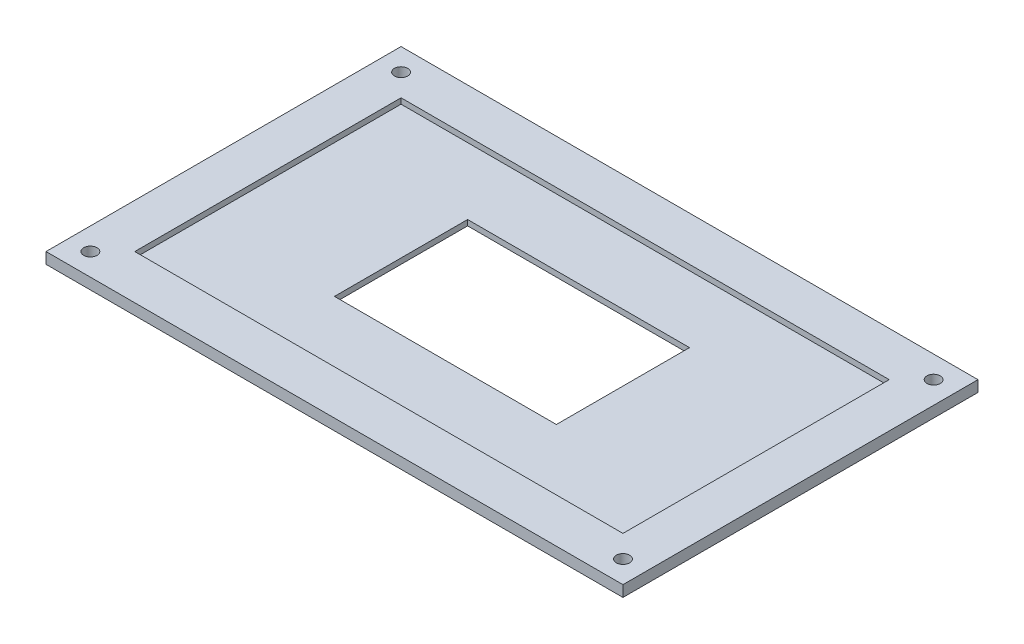
ISO-10303-21;
HEADER;
FILE_DESCRIPTION(('STEP AP214'),'2;1');
FILE_NAME('part.step','',(''),(''),'','','');
FILE_SCHEMA(('AUTOMOTIVE_DESIGN { 1 0 10303 214 1 1 1 1 }'));
ENDSEC;
DATA;
#1=APPLICATION_CONTEXT('core data for automotive mechanical design processes');
#2=APPLICATION_PROTOCOL_DEFINITION('international standard','automotive_design',2000,#1);
#3=PRODUCT_CONTEXT('',#1,'mechanical');
#4=PRODUCT('Part','Part','',(#3));
#5=PRODUCT_RELATED_PRODUCT_CATEGORY('part','',(#4));
#6=PRODUCT_DEFINITION_FORMATION('','',#4);
#7=PRODUCT_DEFINITION_CONTEXT('part definition',#1,'design');
#8=PRODUCT_DEFINITION('design','',#6,#7);
#9=PRODUCT_DEFINITION_SHAPE('','',#8);
#10=(LENGTH_UNIT() NAMED_UNIT(*) SI_UNIT(.MILLI.,.METRE.));
#11=(NAMED_UNIT(*) PLANE_ANGLE_UNIT() SI_UNIT($,.RADIAN.));
#12=(NAMED_UNIT(*) SI_UNIT($,.STERADIAN.) SOLID_ANGLE_UNIT());
#13=UNCERTAINTY_MEASURE_WITH_UNIT(LENGTH_MEASURE(1.E-05),#10,'distance_accuracy_value','');
#14=(GEOMETRIC_REPRESENTATION_CONTEXT(3) GLOBAL_UNCERTAINTY_ASSIGNED_CONTEXT((#13)) GLOBAL_UNIT_ASSIGNED_CONTEXT((#10,
#11,#12)) REPRESENTATION_CONTEXT('',''));
#15=CARTESIAN_POINT('',(0.,0.,0.));
#16=DIRECTION('',(0.,0.,1.));
#17=DIRECTION('',(1.,0.,0.));
#18=AXIS2_PLACEMENT_3D('',#15,#16,#17);
#19=CARTESIAN_POINT('',(0.,2.5,0.));
#20=DIRECTION('',(1.,0.,0.));
#21=DIRECTION('',(0.,0.,-1.));
#22=AXIS2_PLACEMENT_3D('',#19,#20,#21);
#23=PLANE('',#22);
#24=DIRECTION('',(0.,0.,1.));
#25=VECTOR('',#24,1.);
#26=CARTESIAN_POINT('',(0.,0.,0.));
#27=LINE('',#26,#25);
#28=CARTESIAN_POINT('',(0.,0.,-80.));
#29=VERTEX_POINT('',#28);
#30=CARTESIAN_POINT('',(0.,0.,0.));
#31=VERTEX_POINT('',#30);
#32=EDGE_CURVE('E278',#29,#31,#27,.T.);
#33=ORIENTED_EDGE('',*,*,#32,.T.);
#34=DIRECTION('',(0.,-1.,0.));
#35=VECTOR('',#34,1.);
#36=CARTESIAN_POINT('',(0.,2.5,0.));
#37=LINE('',#36,#35);
#38=CARTESIAN_POINT('',(0.,2.5,0.));
#39=VERTEX_POINT('',#38);
#40=EDGE_CURVE('E11',#39,#31,#37,.T.);
#41=ORIENTED_EDGE('',*,*,#40,.F.);
#42=DIRECTION('',(0.,0.,1.));
#43=VECTOR('',#42,1.);
#44=CARTESIAN_POINT('',(0.,2.5,0.));
#45=LINE('',#44,#43);
#46=CARTESIAN_POINT('',(0.,2.5,-80.));
#47=VERTEX_POINT('',#46);
#48=EDGE_CURVE('E288',#47,#39,#45,.T.);
#49=ORIENTED_EDGE('',*,*,#48,.F.);
#50=DIRECTION('',(0.,-1.,0.));
#51=VECTOR('',#50,1.);
#52=CARTESIAN_POINT('',(0.,2.5,-80.));
#53=LINE('',#52,#51);
#54=EDGE_CURVE('E302',#47,#29,#53,.T.);
#55=ORIENTED_EDGE('',*,*,#54,.T.);
#56=EDGE_LOOP('',(#33,#41,#49,#55));
#57=FACE_BOUND('',#56,.T.);
#58=ADVANCED_FACE('F49',(#57),#23,.F.);
#59=CARTESIAN_POINT('',(0.,2.5,0.));
#60=DIRECTION('',(0.,0.,-1.));
#61=DIRECTION('',(-1.,0.,0.));
#62=AXIS2_PLACEMENT_3D('',#59,#60,#61);
#63=PLANE('',#62);
#64=DIRECTION('',(1.,0.,0.));
#65=VECTOR('',#64,1.);
#66=CARTESIAN_POINT('',(0.,0.,0.));
#67=LINE('',#66,#65);
#68=CARTESIAN_POINT('',(130.,0.,0.));
#69=VERTEX_POINT('',#68);
#70=EDGE_CURVE('E306',#31,#69,#67,.T.);
#71=ORIENTED_EDGE('',*,*,#70,.T.);
#72=DIRECTION('',(0.,-1.,0.));
#73=VECTOR('',#72,1.);
#74=CARTESIAN_POINT('',(130.,2.5,0.));
#75=LINE('',#74,#73);
#76=CARTESIAN_POINT('',(130.,2.5,0.));
#77=VERTEX_POINT('',#76);
#78=EDGE_CURVE('E57',#77,#69,#75,.T.);
#79=ORIENTED_EDGE('',*,*,#78,.F.);
#80=DIRECTION('',(1.,0.,0.));
#81=VECTOR('',#80,1.);
#82=CARTESIAN_POINT('',(0.,2.5,0.));
#83=LINE('',#82,#81);
#84=EDGE_CURVE('E292',#39,#77,#83,.T.);
#85=ORIENTED_EDGE('',*,*,#84,.F.);
#86=ORIENTED_EDGE('',*,*,#40,.T.);
#87=EDGE_LOOP('',(#71,#79,#85,#86));
#88=FACE_BOUND('',#87,.T.);
#89=ADVANCED_FACE('F341',(#88),#63,.F.);
#90=CARTESIAN_POINT('',(130.,2.5,0.));
#91=DIRECTION('',(-1.,0.,0.));
#92=DIRECTION('',(0.,0.,1.));
#93=AXIS2_PLACEMENT_3D('',#90,#91,#92);
#94=PLANE('',#93);
#95=DIRECTION('',(0.,0.,-1.));
#96=VECTOR('',#95,1.);
#97=CARTESIAN_POINT('',(130.,0.,0.));
#98=LINE('',#97,#96);
#99=CARTESIAN_POINT('',(130.,0.,-80.));
#100=VERTEX_POINT('',#99);
#101=EDGE_CURVE('E309',#69,#100,#98,.T.);
#102=ORIENTED_EDGE('',*,*,#101,.T.);
#103=DIRECTION('',(0.,-1.,0.));
#104=VECTOR('',#103,1.);
#105=CARTESIAN_POINT('',(130.,2.5,-80.));
#106=LINE('',#105,#104);
#107=CARTESIAN_POINT('',(130.,2.5,-80.));
#108=VERTEX_POINT('',#107);
#109=EDGE_CURVE('E317',#108,#100,#106,.T.);
#110=ORIENTED_EDGE('',*,*,#109,.F.);
#111=DIRECTION('',(0.,0.,-1.));
#112=VECTOR('',#111,1.);
#113=CARTESIAN_POINT('',(130.,2.5,0.));
#114=LINE('',#113,#112);
#115=EDGE_CURVE('E296',#77,#108,#114,.T.);
#116=ORIENTED_EDGE('',*,*,#115,.F.);
#117=ORIENTED_EDGE('',*,*,#78,.T.);
#118=EDGE_LOOP('',(#102,#110,#116,#117));
#119=FACE_BOUND('',#118,.T.);
#120=ADVANCED_FACE('F326',(#119),#94,.F.);
#121=CARTESIAN_POINT('',(0.,2.5,-80.));
#122=DIRECTION('',(0.,0.,1.));
#123=DIRECTION('',(1.,0.,0.));
#124=AXIS2_PLACEMENT_3D('',#121,#122,#123);
#125=PLANE('',#124);
#126=DIRECTION('',(-1.,0.,0.));
#127=VECTOR('',#126,1.);
#128=CARTESIAN_POINT('',(0.,0.,-80.));
#129=LINE('',#128,#127);
#130=EDGE_CURVE('E293',#100,#29,#129,.T.);
#131=ORIENTED_EDGE('',*,*,#130,.T.);
#132=ORIENTED_EDGE('',*,*,#54,.F.);
#133=DIRECTION('',(-1.,0.,0.));
#134=VECTOR('',#133,1.);
#135=CARTESIAN_POINT('',(0.,2.5,-80.));
#136=LINE('',#135,#134);
#137=EDGE_CURVE('E299',#108,#47,#136,.T.);
#138=ORIENTED_EDGE('',*,*,#137,.F.);
#139=ORIENTED_EDGE('',*,*,#109,.T.);
#140=EDGE_LOOP('',(#131,#132,#138,#139));
#141=FACE_BOUND('',#140,.T.);
#142=ADVANCED_FACE('F334',(#141),#125,.F.);
#143=CARTESIAN_POINT('',(0.,2.5,0.));
#144=DIRECTION('',(0.,-1.,0.));
#145=DIRECTION('',(0.,0.,-1.));
#146=AXIS2_PLACEMENT_3D('',#143,#144,#145);
#147=PLANE('',#146);
#148=CARTESIAN_POINT('',(4.99999999999995,2.5,-5.));
#149=DIRECTION('',(0.,1.,0.));
#150=DIRECTION('',(0.,0.,1.));
#151=AXIS2_PLACEMENT_3D('',#148,#149,#150);
#152=CIRCLE('',#151,1.5);
#153=CARTESIAN_POINT('',(4.99999999999995,2.5,-3.5));
#154=VERTEX_POINT('',#153);
#155=EDGE_CURVE('E229',#154,#154,#152,.T.);
#156=ORIENTED_EDGE('',*,*,#155,.F.);
#157=EDGE_LOOP('',(#156));
#158=FACE_BOUND('',#157,.T.);
#159=CARTESIAN_POINT('',(125.,2.5,-5.));
#160=DIRECTION('',(0.,1.,0.));
#161=DIRECTION('',(0.,0.,1.));
#162=AXIS2_PLACEMENT_3D('',#159,#160,#161);
#163=CIRCLE('',#162,1.5);
#164=CARTESIAN_POINT('',(125.,2.5,-3.5));
#165=VERTEX_POINT('',#164);
#166=EDGE_CURVE('E221',#165,#165,#163,.T.);
#167=ORIENTED_EDGE('',*,*,#166,.F.);
#168=EDGE_LOOP('',(#167));
#169=FACE_BOUND('',#168,.T.);
#170=CARTESIAN_POINT('',(125.,2.5,-75.));
#171=DIRECTION('',(0.,1.,0.));
#172=DIRECTION('',(0.,0.,1.));
#173=AXIS2_PLACEMENT_3D('',#170,#171,#172);
#174=CIRCLE('',#173,1.5);
#175=CARTESIAN_POINT('',(125.,2.5,-73.5));
#176=VERTEX_POINT('',#175);
#177=EDGE_CURVE('E212',#176,#176,#174,.T.);
#178=ORIENTED_EDGE('',*,*,#177,.F.);
#179=EDGE_LOOP('',(#178));
#180=FACE_BOUND('',#179,.T.);
#181=CARTESIAN_POINT('',(4.99999999999994,2.5,-75.));
#182=DIRECTION('',(0.,1.,0.));
#183=DIRECTION('',(0.,0.,1.));
#184=AXIS2_PLACEMENT_3D('',#181,#182,#183);
#185=CIRCLE('',#184,1.5);
#186=CARTESIAN_POINT('',(4.99999999999994,2.5,-73.5));
#187=VERTEX_POINT('',#186);
#188=EDGE_CURVE('E216',#187,#187,#185,.T.);
#189=ORIENTED_EDGE('',*,*,#188,.F.);
#190=EDGE_LOOP('',(#189));
#191=FACE_BOUND('',#190,.T.);
#192=DIRECTION('',(1.,0.,0.));
#193=VECTOR('',#192,1.);
#194=CARTESIAN_POINT('',(9.99999999999995,2.5,-10.));
#195=LINE('',#194,#193);
#196=CARTESIAN_POINT('',(9.99999999999995,2.5,-10.));
#197=VERTEX_POINT('',#196);
#198=CARTESIAN_POINT('',(120.,2.5,-10.));
#199=VERTEX_POINT('',#198);
#200=EDGE_CURVE('E264',#197,#199,#195,.T.);
#201=ORIENTED_EDGE('',*,*,#200,.F.);
#202=DIRECTION('',(0.,0.,1.));
#203=VECTOR('',#202,1.);
#204=CARTESIAN_POINT('',(9.99999999999994,2.5,-70.));
#205=LINE('',#204,#203);
#206=CARTESIAN_POINT('',(9.99999999999994,2.5,-70.));
#207=VERTEX_POINT('',#206);
#208=EDGE_CURVE('E240',#207,#197,#205,.T.);
#209=ORIENTED_EDGE('',*,*,#208,.F.);
#210=DIRECTION('',(-1.,0.,0.));
#211=VECTOR('',#210,1.);
#212=CARTESIAN_POINT('',(9.99999999999994,2.5,-70.));
#213=LINE('',#212,#211);
#214=CARTESIAN_POINT('',(120.,2.5,-70.));
#215=VERTEX_POINT('',#214);
#216=EDGE_CURVE('E249',#215,#207,#213,.T.);
#217=ORIENTED_EDGE('',*,*,#216,.F.);
#218=DIRECTION('',(0.,0.,-1.));
#219=VECTOR('',#218,1.);
#220=CARTESIAN_POINT('',(120.,2.5,-70.));
#221=LINE('',#220,#219);
#222=EDGE_CURVE('E268',#199,#215,#221,.T.);
#223=ORIENTED_EDGE('',*,*,#222,.F.);
#224=EDGE_LOOP('',(#201,#209,#217,#223));
#225=FACE_BOUND('',#224,.T.);
#226=ORIENTED_EDGE('',*,*,#48,.T.);
#227=ORIENTED_EDGE('',*,*,#84,.T.);
#228=ORIENTED_EDGE('',*,*,#115,.T.);
#229=ORIENTED_EDGE('',*,*,#137,.T.);
#230=EDGE_LOOP('',(#226,#227,#228,#229));
#231=FACE_BOUND('',#230,.T.);
#232=ADVANCED_FACE('F340',(#158,#169,#180,#191,#225,#231),#147,.F.);
#233=CARTESIAN_POINT('',(0.,0.,0.));
#234=DIRECTION('',(0.,-1.,0.));
#235=DIRECTION('',(0.,0.,-1.));
#236=AXIS2_PLACEMENT_3D('',#233,#234,#235);
#237=PLANE('',#236);
#238=DIRECTION('',(0.,0.,1.));
#239=VECTOR('',#238,1.);
#240=CARTESIAN_POINT('',(39.9999999999999,0.,-55.));
#241=LINE('',#240,#239);
#242=CARTESIAN_POINT('',(39.9999999999999,0.,-55.));
#243=VERTEX_POINT('',#242);
#244=CARTESIAN_POINT('',(40.,0.,-25.));
#245=VERTEX_POINT('',#244);
#246=EDGE_CURVE('E165',#243,#245,#241,.T.);
#247=ORIENTED_EDGE('',*,*,#246,.T.);
#248=DIRECTION('',(1.,0.,0.));
#249=VECTOR('',#248,1.);
#250=CARTESIAN_POINT('',(40.,0.,-25.));
#251=LINE('',#250,#249);
#252=CARTESIAN_POINT('',(89.9999999999999,0.,-25.));
#253=VERTEX_POINT('',#252);
#254=EDGE_CURVE('E177',#245,#253,#251,.T.);
#255=ORIENTED_EDGE('',*,*,#254,.T.);
#256=DIRECTION('',(0.,0.,-1.));
#257=VECTOR('',#256,1.);
#258=CARTESIAN_POINT('',(89.9999999999999,0.,-55.));
#259=LINE('',#258,#257);
#260=CARTESIAN_POINT('',(89.9999999999999,0.,-55.));
#261=VERTEX_POINT('',#260);
#262=EDGE_CURVE('E74',#253,#261,#259,.T.);
#263=ORIENTED_EDGE('',*,*,#262,.T.);
#264=DIRECTION('',(-1.,0.,0.));
#265=VECTOR('',#264,1.);
#266=CARTESIAN_POINT('',(39.9999999999999,0.,-55.));
#267=LINE('',#266,#265);
#268=EDGE_CURVE('E174',#261,#243,#267,.T.);
#269=ORIENTED_EDGE('',*,*,#268,.T.);
#270=EDGE_LOOP('',(#247,#255,#263,#269));
#271=FACE_BOUND('',#270,.T.);
#272=CARTESIAN_POINT('',(4.99999999999995,0.,-5.));
#273=DIRECTION('',(0.,1.,0.));
#274=DIRECTION('',(0.,0.,1.));
#275=AXIS2_PLACEMENT_3D('',#272,#273,#274);
#276=CIRCLE('',#275,1.5);
#277=CARTESIAN_POINT('',(4.99999999999995,0.,-3.5));
#278=VERTEX_POINT('',#277);
#279=EDGE_CURVE('E206',#278,#278,#276,.T.);
#280=ORIENTED_EDGE('',*,*,#279,.T.);
#281=EDGE_LOOP('',(#280));
#282=FACE_BOUND('',#281,.T.);
#283=CARTESIAN_POINT('',(125.,0.,-5.));
#284=DIRECTION('',(0.,1.,0.));
#285=DIRECTION('',(0.,0.,1.));
#286=AXIS2_PLACEMENT_3D('',#283,#284,#285);
#287=CIRCLE('',#286,1.5);
#288=CARTESIAN_POINT('',(125.,0.,-3.5));
#289=VERTEX_POINT('',#288);
#290=EDGE_CURVE('E225',#289,#289,#287,.T.);
#291=ORIENTED_EDGE('',*,*,#290,.T.);
#292=EDGE_LOOP('',(#291));
#293=FACE_BOUND('',#292,.T.);
#294=CARTESIAN_POINT('',(125.,0.,-75.));
#295=DIRECTION('',(0.,1.,0.));
#296=DIRECTION('',(0.,0.,1.));
#297=AXIS2_PLACEMENT_3D('',#294,#295,#296);
#298=CIRCLE('',#297,1.5);
#299=CARTESIAN_POINT('',(125.,0.,-73.5));
#300=VERTEX_POINT('',#299);
#301=EDGE_CURVE('E217',#300,#300,#298,.T.);
#302=ORIENTED_EDGE('',*,*,#301,.T.);
#303=EDGE_LOOP('',(#302));
#304=FACE_BOUND('',#303,.T.);
#305=CARTESIAN_POINT('',(4.99999999999994,0.,-75.));
#306=DIRECTION('',(0.,1.,0.));
#307=DIRECTION('',(0.,0.,1.));
#308=AXIS2_PLACEMENT_3D('',#305,#306,#307);
#309=CIRCLE('',#308,1.5);
#310=CARTESIAN_POINT('',(4.99999999999994,0.,-73.5));
#311=VERTEX_POINT('',#310);
#312=EDGE_CURVE('E236',#311,#311,#309,.T.);
#313=ORIENTED_EDGE('',*,*,#312,.T.);
#314=EDGE_LOOP('',(#313));
#315=FACE_BOUND('',#314,.T.);
#316=ORIENTED_EDGE('',*,*,#32,.F.);
#317=ORIENTED_EDGE('',*,*,#130,.F.);
#318=ORIENTED_EDGE('',*,*,#101,.F.);
#319=ORIENTED_EDGE('',*,*,#70,.F.);
#320=EDGE_LOOP('',(#316,#317,#318,#319));
#321=FACE_BOUND('',#320,.T.);
#322=ADVANCED_FACE('F182',(#271,#282,#293,#304,#315,#321),#237,.T.);
#323=CARTESIAN_POINT('',(9.99999999999994,1.25,-70.));
#324=DIRECTION('',(-1.,0.,0.));
#325=DIRECTION('',(0.,0.,1.));
#326=AXIS2_PLACEMENT_3D('',#323,#324,#325);
#327=PLANE('',#326);
#328=ORIENTED_EDGE('',*,*,#208,.T.);
#329=DIRECTION('',(0.,1.,0.));
#330=VECTOR('',#329,1.);
#331=CARTESIAN_POINT('',(9.99999999999995,1.25,-10.));
#332=LINE('',#331,#330);
#333=CARTESIAN_POINT('',(9.99999999999995,1.25,-10.));
#334=VERTEX_POINT('',#333);
#335=EDGE_CURVE('E261',#334,#197,#332,.T.);
#336=ORIENTED_EDGE('',*,*,#335,.F.);
#337=DIRECTION('',(0.,0.,1.));
#338=VECTOR('',#337,1.);
#339=CARTESIAN_POINT('',(9.99999999999994,1.25,-70.));
#340=LINE('',#339,#338);
#341=CARTESIAN_POINT('',(9.99999999999994,1.25,-70.));
#342=VERTEX_POINT('',#341);
#343=EDGE_CURVE('E244',#342,#334,#340,.T.);
#344=ORIENTED_EDGE('',*,*,#343,.F.);
#345=DIRECTION('',(0.,1.,0.));
#346=VECTOR('',#345,1.);
#347=CARTESIAN_POINT('',(9.99999999999994,1.25,-70.));
#348=LINE('',#347,#346);
#349=EDGE_CURVE('E275',#342,#207,#348,.T.);
#350=ORIENTED_EDGE('',*,*,#349,.T.);
#351=EDGE_LOOP('',(#328,#336,#344,#350));
#352=FACE_BOUND('',#351,.T.);
#353=ADVANCED_FACE('F353',(#352),#327,.F.);
#354=CARTESIAN_POINT('',(9.99999999999994,1.25,-70.));
#355=DIRECTION('',(0.,0.,-1.));
#356=DIRECTION('',(-1.,0.,0.));
#357=AXIS2_PLACEMENT_3D('',#354,#355,#356);
#358=PLANE('',#357);
#359=ORIENTED_EDGE('',*,*,#216,.T.);
#360=ORIENTED_EDGE('',*,*,#349,.F.);
#361=DIRECTION('',(-1.,0.,0.));
#362=VECTOR('',#361,1.);
#363=CARTESIAN_POINT('',(9.99999999999994,1.25,-70.));
#364=LINE('',#363,#362);
#365=CARTESIAN_POINT('',(120.,1.25,-70.));
#366=VERTEX_POINT('',#365);
#367=EDGE_CURVE('E257',#366,#342,#364,.T.);
#368=ORIENTED_EDGE('',*,*,#367,.F.);
#369=DIRECTION('',(0.,1.,0.));
#370=VECTOR('',#369,1.);
#371=CARTESIAN_POINT('',(120.,1.25,-70.));
#372=LINE('',#371,#370);
#373=EDGE_CURVE('E279',#366,#215,#372,.T.);
#374=ORIENTED_EDGE('',*,*,#373,.T.);
#375=EDGE_LOOP('',(#359,#360,#368,#374));
#376=FACE_BOUND('',#375,.T.);
#377=ADVANCED_FACE('F359',(#376),#358,.F.);
#378=CARTESIAN_POINT('',(120.,1.25,-70.));
#379=DIRECTION('',(1.,0.,0.));
#380=DIRECTION('',(0.,0.,-1.));
#381=AXIS2_PLACEMENT_3D('',#378,#379,#380);
#382=PLANE('',#381);
#383=ORIENTED_EDGE('',*,*,#222,.T.);
#384=ORIENTED_EDGE('',*,*,#373,.F.);
#385=DIRECTION('',(0.,0.,-1.));
#386=VECTOR('',#385,1.);
#387=CARTESIAN_POINT('',(120.,1.25,-70.));
#388=LINE('',#387,#386);
#389=CARTESIAN_POINT('',(120.,1.25,-10.));
#390=VERTEX_POINT('',#389);
#391=EDGE_CURVE('E253',#390,#366,#388,.T.);
#392=ORIENTED_EDGE('',*,*,#391,.F.);
#393=DIRECTION('',(0.,1.,0.));
#394=VECTOR('',#393,1.);
#395=CARTESIAN_POINT('',(120.,1.25,-10.));
#396=LINE('',#395,#394);
#397=EDGE_CURVE('E282',#390,#199,#396,.T.);
#398=ORIENTED_EDGE('',*,*,#397,.T.);
#399=EDGE_LOOP('',(#383,#384,#392,#398));
#400=FACE_BOUND('',#399,.T.);
#401=ADVANCED_FACE('F365',(#400),#382,.F.);
#402=CARTESIAN_POINT('',(9.99999999999995,1.25,-10.));
#403=DIRECTION('',(0.,0.,1.));
#404=DIRECTION('',(1.,0.,0.));
#405=AXIS2_PLACEMENT_3D('',#402,#403,#404);
#406=PLANE('',#405);
#407=ORIENTED_EDGE('',*,*,#200,.T.);
#408=ORIENTED_EDGE('',*,*,#397,.F.);
#409=DIRECTION('',(1.,0.,0.));
#410=VECTOR('',#409,1.);
#411=CARTESIAN_POINT('',(9.99999999999995,1.25,-10.));
#412=LINE('',#411,#410);
#413=EDGE_CURVE('E248',#334,#390,#412,.T.);
#414=ORIENTED_EDGE('',*,*,#413,.F.);
#415=ORIENTED_EDGE('',*,*,#335,.T.);
#416=EDGE_LOOP('',(#407,#408,#414,#415));
#417=FACE_BOUND('',#416,.T.);
#418=ADVANCED_FACE('F361',(#417),#406,.F.);
#419=CARTESIAN_POINT('',(0.,1.25,0.));
#420=DIRECTION('',(0.,1.,0.));
#421=DIRECTION('',(0.,0.,1.));
#422=AXIS2_PLACEMENT_3D('',#419,#420,#421);
#423=PLANE('',#422);
#424=DIRECTION('',(0.,0.,1.));
#425=VECTOR('',#424,1.);
#426=CARTESIAN_POINT('',(39.9999999999999,1.25,-55.));
#427=LINE('',#426,#425);
#428=CARTESIAN_POINT('',(39.9999999999999,1.25,-55.));
#429=VERTEX_POINT('',#428);
#430=CARTESIAN_POINT('',(40.,1.25,-25.));
#431=VERTEX_POINT('',#430);
#432=EDGE_CURVE('E168',#429,#431,#427,.T.);
#433=ORIENTED_EDGE('',*,*,#432,.F.);
#434=DIRECTION('',(-1.,0.,0.));
#435=VECTOR('',#434,1.);
#436=CARTESIAN_POINT('',(39.9999999999999,1.25,-55.));
#437=LINE('',#436,#435);
#438=CARTESIAN_POINT('',(89.9999999999999,1.25,-55.));
#439=VERTEX_POINT('',#438);
#440=EDGE_CURVE('E186',#439,#429,#437,.T.);
#441=ORIENTED_EDGE('',*,*,#440,.F.);
#442=DIRECTION('',(0.,0.,-1.));
#443=VECTOR('',#442,1.);
#444=CARTESIAN_POINT('',(89.9999999999999,1.25,-55.));
#445=LINE('',#444,#443);
#446=CARTESIAN_POINT('',(89.9999999999999,1.25,-25.));
#447=VERTEX_POINT('',#446);
#448=EDGE_CURVE('E67',#447,#439,#445,.T.);
#449=ORIENTED_EDGE('',*,*,#448,.F.);
#450=DIRECTION('',(1.,0.,0.));
#451=VECTOR('',#450,1.);
#452=CARTESIAN_POINT('',(40.,1.25,-25.));
#453=LINE('',#452,#451);
#454=EDGE_CURVE('E198',#431,#447,#453,.T.);
#455=ORIENTED_EDGE('',*,*,#454,.F.);
#456=EDGE_LOOP('',(#433,#441,#449,#455));
#457=FACE_BOUND('',#456,.T.);
#458=ORIENTED_EDGE('',*,*,#343,.T.);
#459=ORIENTED_EDGE('',*,*,#413,.T.);
#460=ORIENTED_EDGE('',*,*,#391,.T.);
#461=ORIENTED_EDGE('',*,*,#367,.T.);
#462=EDGE_LOOP('',(#458,#459,#460,#461));
#463=FACE_BOUND('',#462,.T.);
#464=ADVANCED_FACE('F364',(#457,#463),#423,.T.);
#465=CARTESIAN_POINT('',(4.99999999999994,0.,-75.));
#466=DIRECTION('',(0.,1.,0.));
#467=DIRECTION('',(0.,0.,1.));
#468=AXIS2_PLACEMENT_3D('',#465,#466,#467);
#469=CYLINDRICAL_SURFACE('',#468,1.5);
#470=ORIENTED_EDGE('',*,*,#312,.F.);
#471=EDGE_LOOP('',(#470));
#472=FACE_BOUND('',#471,.T.);
#473=ORIENTED_EDGE('',*,*,#188,.T.);
#474=EDGE_LOOP('',(#473));
#475=FACE_BOUND('',#474,.T.);
#476=ADVANCED_FACE('F375',(#472,#475),#469,.F.);
#477=CARTESIAN_POINT('',(125.,0.,-75.));
#478=DIRECTION('',(0.,1.,0.));
#479=DIRECTION('',(0.,0.,1.));
#480=AXIS2_PLACEMENT_3D('',#477,#478,#479);
#481=CYLINDRICAL_SURFACE('',#480,1.5);
#482=ORIENTED_EDGE('',*,*,#301,.F.);
#483=EDGE_LOOP('',(#482));
#484=FACE_BOUND('',#483,.T.);
#485=ORIENTED_EDGE('',*,*,#177,.T.);
#486=EDGE_LOOP('',(#485));
#487=FACE_BOUND('',#486,.T.);
#488=ADVANCED_FACE('F379',(#484,#487),#481,.F.);
#489=CARTESIAN_POINT('',(125.,0.,-5.));
#490=DIRECTION('',(0.,1.,0.));
#491=DIRECTION('',(0.,0.,1.));
#492=AXIS2_PLACEMENT_3D('',#489,#490,#491);
#493=CYLINDRICAL_SURFACE('',#492,1.5);
#494=ORIENTED_EDGE('',*,*,#290,.F.);
#495=EDGE_LOOP('',(#494));
#496=FACE_BOUND('',#495,.T.);
#497=ORIENTED_EDGE('',*,*,#166,.T.);
#498=EDGE_LOOP('',(#497));
#499=FACE_BOUND('',#498,.T.);
#500=ADVANCED_FACE('F384',(#496,#499),#493,.F.);
#501=CARTESIAN_POINT('',(4.99999999999995,0.,-5.));
#502=DIRECTION('',(0.,1.,0.));
#503=DIRECTION('',(0.,0.,1.));
#504=AXIS2_PLACEMENT_3D('',#501,#502,#503);
#505=CYLINDRICAL_SURFACE('',#504,1.5);
#506=ORIENTED_EDGE('',*,*,#279,.F.);
#507=EDGE_LOOP('',(#506));
#508=FACE_BOUND('',#507,.T.);
#509=ORIENTED_EDGE('',*,*,#155,.T.);
#510=EDGE_LOOP('',(#509));
#511=FACE_BOUND('',#510,.T.);
#512=ADVANCED_FACE('F381',(#508,#511),#505,.F.);
#513=CARTESIAN_POINT('',(39.9999999999999,0.,-55.));
#514=DIRECTION('',(-1.,0.,0.));
#515=DIRECTION('',(0.,0.,1.));
#516=AXIS2_PLACEMENT_3D('',#513,#514,#515);
#517=PLANE('',#516);
#518=ORIENTED_EDGE('',*,*,#432,.T.);
#519=DIRECTION('',(0.,1.,0.));
#520=VECTOR('',#519,1.);
#521=CARTESIAN_POINT('',(40.,0.,-25.));
#522=LINE('',#521,#520);
#523=EDGE_CURVE('E161',#245,#431,#522,.T.);
#524=ORIENTED_EDGE('',*,*,#523,.F.);
#525=ORIENTED_EDGE('',*,*,#246,.F.);
#526=DIRECTION('',(0.,1.,0.));
#527=VECTOR('',#526,1.);
#528=CARTESIAN_POINT('',(39.9999999999999,0.,-55.));
#529=LINE('',#528,#527);
#530=EDGE_CURVE('E203',#243,#429,#529,.T.);
#531=ORIENTED_EDGE('',*,*,#530,.T.);
#532=EDGE_LOOP('',(#518,#524,#525,#531));
#533=FACE_BOUND('',#532,.T.);
#534=ADVANCED_FACE('F163',(#533),#517,.F.);
#535=CARTESIAN_POINT('',(39.9999999999999,0.,-55.));
#536=DIRECTION('',(0.,0.,-1.));
#537=DIRECTION('',(-1.,0.,0.));
#538=AXIS2_PLACEMENT_3D('',#535,#536,#537);
#539=PLANE('',#538);
#540=ORIENTED_EDGE('',*,*,#440,.T.);
#541=ORIENTED_EDGE('',*,*,#530,.F.);
#542=ORIENTED_EDGE('',*,*,#268,.F.);
#543=DIRECTION('',(0.,1.,0.));
#544=VECTOR('',#543,1.);
#545=CARTESIAN_POINT('',(89.9999999999999,0.,-55.));
#546=LINE('',#545,#544);
#547=EDGE_CURVE('E207',#261,#439,#546,.T.);
#548=ORIENTED_EDGE('',*,*,#547,.T.);
#549=EDGE_LOOP('',(#540,#541,#542,#548));
#550=FACE_BOUND('',#549,.T.);
#551=ADVANCED_FACE('F394',(#550),#539,.F.);
#552=CARTESIAN_POINT('',(89.9999999999999,0.,-55.));
#553=DIRECTION('',(1.,0.,0.));
#554=DIRECTION('',(0.,0.,-1.));
#555=AXIS2_PLACEMENT_3D('',#552,#553,#554);
#556=PLANE('',#555);
#557=ORIENTED_EDGE('',*,*,#448,.T.);
#558=ORIENTED_EDGE('',*,*,#547,.F.);
#559=ORIENTED_EDGE('',*,*,#262,.F.);
#560=DIRECTION('',(0.,1.,0.));
#561=VECTOR('',#560,1.);
#562=CARTESIAN_POINT('',(89.9999999999999,0.,-25.));
#563=LINE('',#562,#561);
#564=EDGE_CURVE('E173',#253,#447,#563,.T.);
#565=ORIENTED_EDGE('',*,*,#564,.T.);
#566=EDGE_LOOP('',(#557,#558,#559,#565));
#567=FACE_BOUND('',#566,.T.);
#568=ADVANCED_FACE('F396',(#567),#556,.F.);
#569=CARTESIAN_POINT('',(40.,0.,-25.));
#570=DIRECTION('',(0.,0.,1.));
#571=DIRECTION('',(1.,0.,0.));
#572=AXIS2_PLACEMENT_3D('',#569,#570,#571);
#573=PLANE('',#572);
#574=ORIENTED_EDGE('',*,*,#454,.T.);
#575=ORIENTED_EDGE('',*,*,#564,.F.);
#576=ORIENTED_EDGE('',*,*,#254,.F.);
#577=ORIENTED_EDGE('',*,*,#523,.T.);
#578=EDGE_LOOP('',(#574,#575,#576,#577));
#579=FACE_BOUND('',#578,.T.);
#580=ADVANCED_FACE('F178',(#579),#573,.F.);
#581=CLOSED_SHELL('',(#58,#89,#120,#142,#232,#322,#353,#377,#401,#418,#464,#476,#488,#500,#512,
#534,#551,#568,#580));
#582=MANIFOLD_SOLID_BREP('B2',#581);
#583=ADVANCED_BREP_SHAPE_REPRESENTATION('',(#18,#582),#14);
#584=SHAPE_DEFINITION_REPRESENTATION(#9,#583);
ENDSEC;
END-ISO-10303-21;
